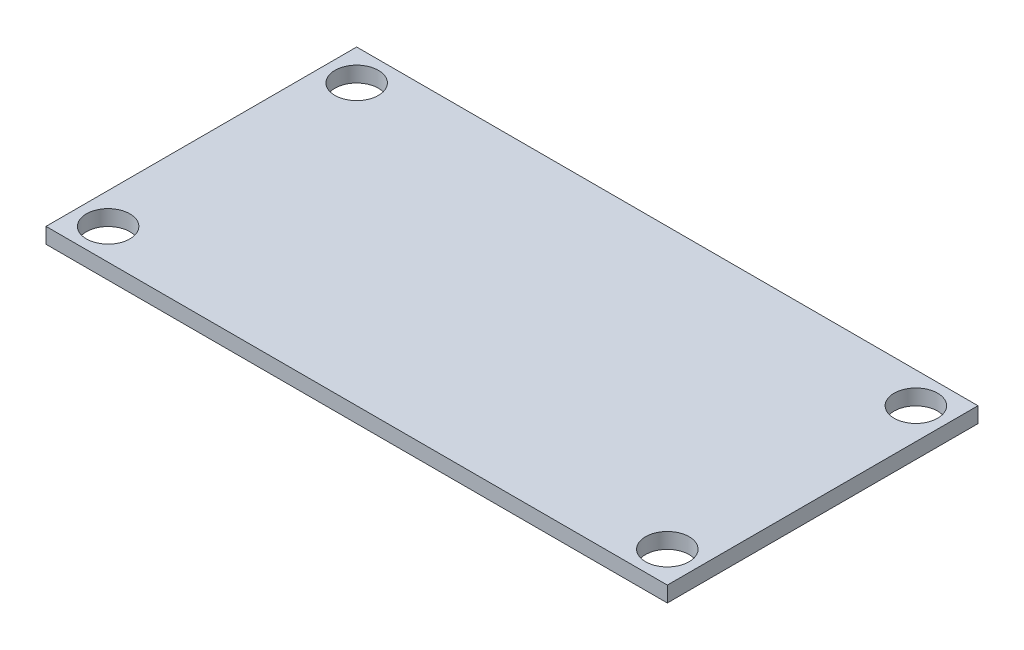
ISO-10303-21;
HEADER;
FILE_DESCRIPTION(('STEP AP214'),'2;1');
FILE_NAME('part.step','',(''),(''),'','','');
FILE_SCHEMA(('AUTOMOTIVE_DESIGN { 1 0 10303 214 1 1 1 1 }'));
ENDSEC;
DATA;
#1=APPLICATION_CONTEXT('core data for automotive mechanical design processes');
#2=APPLICATION_PROTOCOL_DEFINITION('international standard','automotive_design',2000,#1);
#3=PRODUCT_CONTEXT('',#1,'mechanical');
#4=PRODUCT('Part','Part','',(#3));
#5=PRODUCT_RELATED_PRODUCT_CATEGORY('part','',(#4));
#6=PRODUCT_DEFINITION_FORMATION('','',#4);
#7=PRODUCT_DEFINITION_CONTEXT('part definition',#1,'design');
#8=PRODUCT_DEFINITION('design','',#6,#7);
#9=PRODUCT_DEFINITION_SHAPE('','',#8);
#10=(LENGTH_UNIT() NAMED_UNIT(*) SI_UNIT(.MILLI.,.METRE.));
#11=(NAMED_UNIT(*) PLANE_ANGLE_UNIT() SI_UNIT($,.RADIAN.));
#12=(NAMED_UNIT(*) SI_UNIT($,.STERADIAN.) SOLID_ANGLE_UNIT());
#13=UNCERTAINTY_MEASURE_WITH_UNIT(LENGTH_MEASURE(1.E-05),#10,'distance_accuracy_value','');
#14=(GEOMETRIC_REPRESENTATION_CONTEXT(3) GLOBAL_UNCERTAINTY_ASSIGNED_CONTEXT((#13)) GLOBAL_UNIT_ASSIGNED_CONTEXT((#10,
#11,#12)) REPRESENTATION_CONTEXT('',''));
#15=CARTESIAN_POINT('',(0.,0.,0.));
#16=DIRECTION('',(0.,0.,1.));
#17=DIRECTION('',(1.,0.,0.));
#18=AXIS2_PLACEMENT_3D('',#15,#16,#17);
#19=CARTESIAN_POINT('',(0.,1.,0.));
#20=DIRECTION('',(1.,0.,0.));
#21=DIRECTION('',(0.,0.,-1.));
#22=AXIS2_PLACEMENT_3D('',#19,#20,#21);
#23=PLANE('',#22);
#24=DIRECTION('',(0.,0.,1.));
#25=VECTOR('',#24,1.);
#26=CARTESIAN_POINT('',(0.,0.,0.));
#27=LINE('',#26,#25);
#28=CARTESIAN_POINT('',(0.,0.,-20.));
#29=VERTEX_POINT('',#28);
#30=CARTESIAN_POINT('',(0.,0.,0.));
#31=VERTEX_POINT('',#30);
#32=EDGE_CURVE('E96',#29,#31,#27,.T.);
#33=ORIENTED_EDGE('',*,*,#32,.T.);
#34=DIRECTION('',(0.,-1.,0.));
#35=VECTOR('',#34,1.);
#36=CARTESIAN_POINT('',(0.,1.,0.));
#37=LINE('',#36,#35);
#38=CARTESIAN_POINT('',(0.,1.,0.));
#39=VERTEX_POINT('',#38);
#40=EDGE_CURVE('E11',#39,#31,#37,.T.);
#41=ORIENTED_EDGE('',*,*,#40,.F.);
#42=DIRECTION('',(0.,0.,1.));
#43=VECTOR('',#42,1.);
#44=CARTESIAN_POINT('',(0.,1.,0.));
#45=LINE('',#44,#43);
#46=CARTESIAN_POINT('',(0.,1.,-20.));
#47=VERTEX_POINT('',#46);
#48=EDGE_CURVE('E84',#47,#39,#45,.T.);
#49=ORIENTED_EDGE('',*,*,#48,.F.);
#50=DIRECTION('',(0.,-1.,0.));
#51=VECTOR('',#50,1.);
#52=CARTESIAN_POINT('',(0.,1.,-20.));
#53=LINE('',#52,#51);
#54=EDGE_CURVE('E92',#47,#29,#53,.T.);
#55=ORIENTED_EDGE('',*,*,#54,.T.);
#56=EDGE_LOOP('',(#33,#41,#49,#55));
#57=FACE_BOUND('',#56,.T.);
#58=ADVANCED_FACE('F33',(#57),#23,.F.);
#59=CARTESIAN_POINT('',(0.,1.,0.));
#60=DIRECTION('',(0.,0.,-1.));
#61=DIRECTION('',(-1.,0.,0.));
#62=AXIS2_PLACEMENT_3D('',#59,#60,#61);
#63=PLANE('',#62);
#64=DIRECTION('',(1.,0.,0.));
#65=VECTOR('',#64,1.);
#66=CARTESIAN_POINT('',(0.,0.,0.));
#67=LINE('',#66,#65);
#68=CARTESIAN_POINT('',(40.,0.,0.));
#69=VERTEX_POINT('',#68);
#70=EDGE_CURVE('E88',#31,#69,#67,.T.);
#71=ORIENTED_EDGE('',*,*,#70,.T.);
#72=DIRECTION('',(0.,-1.,0.));
#73=VECTOR('',#72,1.);
#74=CARTESIAN_POINT('',(40.,1.,0.));
#75=LINE('',#74,#73);
#76=CARTESIAN_POINT('',(40.,1.,0.));
#77=VERTEX_POINT('',#76);
#78=EDGE_CURVE('E41',#77,#69,#75,.T.);
#79=ORIENTED_EDGE('',*,*,#78,.F.);
#80=DIRECTION('',(1.,0.,0.));
#81=VECTOR('',#80,1.);
#82=CARTESIAN_POINT('',(0.,1.,0.));
#83=LINE('',#82,#81);
#84=EDGE_CURVE('E79',#39,#77,#83,.T.);
#85=ORIENTED_EDGE('',*,*,#84,.F.);
#86=ORIENTED_EDGE('',*,*,#40,.T.);
#87=EDGE_LOOP('',(#71,#79,#85,#86));
#88=FACE_BOUND('',#87,.T.);
#89=ADVANCED_FACE('F87',(#88),#63,.F.);
#90=CARTESIAN_POINT('',(40.,1.,0.));
#91=DIRECTION('',(-1.,0.,0.));
#92=DIRECTION('',(0.,0.,1.));
#93=AXIS2_PLACEMENT_3D('',#90,#91,#92);
#94=PLANE('',#93);
#95=DIRECTION('',(0.,0.,-1.));
#96=VECTOR('',#95,1.);
#97=CARTESIAN_POINT('',(40.,0.,0.));
#98=LINE('',#97,#96);
#99=CARTESIAN_POINT('',(40.,0.,-20.));
#100=VERTEX_POINT('',#99);
#101=EDGE_CURVE('E66',#69,#100,#98,.T.);
#102=ORIENTED_EDGE('',*,*,#101,.T.);
#103=DIRECTION('',(0.,-1.,0.));
#104=VECTOR('',#103,1.);
#105=CARTESIAN_POINT('',(40.,1.,-20.));
#106=LINE('',#105,#104);
#107=CARTESIAN_POINT('',(40.,1.,-20.));
#108=VERTEX_POINT('',#107);
#109=EDGE_CURVE('E89',#108,#100,#106,.T.);
#110=ORIENTED_EDGE('',*,*,#109,.F.);
#111=DIRECTION('',(0.,0.,-1.));
#112=VECTOR('',#111,1.);
#113=CARTESIAN_POINT('',(40.,1.,0.));
#114=LINE('',#113,#112);
#115=EDGE_CURVE('E82',#77,#108,#114,.T.);
#116=ORIENTED_EDGE('',*,*,#115,.F.);
#117=ORIENTED_EDGE('',*,*,#78,.T.);
#118=EDGE_LOOP('',(#102,#110,#116,#117));
#119=FACE_BOUND('',#118,.T.);
#120=ADVANCED_FACE('F90',(#119),#94,.F.);
#121=CARTESIAN_POINT('',(0.,1.,-20.));
#122=DIRECTION('',(0.,0.,1.));
#123=DIRECTION('',(1.,0.,0.));
#124=AXIS2_PLACEMENT_3D('',#121,#122,#123);
#125=PLANE('',#124);
#126=DIRECTION('',(-1.,0.,0.));
#127=VECTOR('',#126,1.);
#128=CARTESIAN_POINT('',(0.,0.,-20.));
#129=LINE('',#128,#127);
#130=EDGE_CURVE('E72',#100,#29,#129,.T.);
#131=ORIENTED_EDGE('',*,*,#130,.T.);
#132=ORIENTED_EDGE('',*,*,#54,.F.);
#133=DIRECTION('',(-1.,0.,0.));
#134=VECTOR('',#133,1.);
#135=CARTESIAN_POINT('',(0.,1.,-20.));
#136=LINE('',#135,#134);
#137=EDGE_CURVE('E49',#108,#47,#136,.T.);
#138=ORIENTED_EDGE('',*,*,#137,.F.);
#139=ORIENTED_EDGE('',*,*,#109,.T.);
#140=EDGE_LOOP('',(#131,#132,#138,#139));
#141=FACE_BOUND('',#140,.T.);
#142=ADVANCED_FACE('F104',(#141),#125,.F.);
#143=CARTESIAN_POINT('',(0.,1.,0.));
#144=DIRECTION('',(0.,-1.,0.));
#145=DIRECTION('',(0.,0.,-1.));
#146=AXIS2_PLACEMENT_3D('',#143,#144,#145);
#147=PLANE('',#146);
#148=CARTESIAN_POINT('',(2.00000000000001,1.,-2.00000000000001));
#149=DIRECTION('',(0.,1.,0.));
#150=DIRECTION('',(0.,0.,1.));
#151=AXIS2_PLACEMENT_3D('',#148,#149,#150);
#152=CIRCLE('',#151,1.4);
#153=CARTESIAN_POINT('',(2.00000000000001,1.,-0.600000000000009));
#154=VERTEX_POINT('',#153);
#155=EDGE_CURVE('E116',#154,#154,#152,.T.);
#156=ORIENTED_EDGE('',*,*,#155,.F.);
#157=EDGE_LOOP('',(#156));
#158=FACE_BOUND('',#157,.T.);
#159=CARTESIAN_POINT('',(38.,1.,-2.));
#160=DIRECTION('',(0.,1.,0.));
#161=DIRECTION('',(0.,0.,1.));
#162=AXIS2_PLACEMENT_3D('',#159,#160,#161);
#163=CIRCLE('',#162,1.4);
#164=CARTESIAN_POINT('',(38.,1.,-0.599999999999999));
#165=VERTEX_POINT('',#164);
#166=EDGE_CURVE('E122',#165,#165,#163,.T.);
#167=ORIENTED_EDGE('',*,*,#166,.F.);
#168=EDGE_LOOP('',(#167));
#169=FACE_BOUND('',#168,.T.);
#170=CARTESIAN_POINT('',(38.,1.,-18.));
#171=DIRECTION('',(0.,1.,0.));
#172=DIRECTION('',(0.,0.,1.));
#173=AXIS2_PLACEMENT_3D('',#170,#171,#172);
#174=CIRCLE('',#173,1.4);
#175=CARTESIAN_POINT('',(38.,1.,-16.6));
#176=VERTEX_POINT('',#175);
#177=EDGE_CURVE('E128',#176,#176,#174,.T.);
#178=ORIENTED_EDGE('',*,*,#177,.F.);
#179=EDGE_LOOP('',(#178));
#180=FACE_BOUND('',#179,.T.);
#181=CARTESIAN_POINT('',(2.,1.,-18.));
#182=DIRECTION('',(0.,1.,0.));
#183=DIRECTION('',(0.,0.,1.));
#184=AXIS2_PLACEMENT_3D('',#181,#182,#183);
#185=CIRCLE('',#184,1.4);
#186=CARTESIAN_POINT('',(2.,1.,-16.6));
#187=VERTEX_POINT('',#186);
#188=EDGE_CURVE('E110',#187,#187,#185,.T.);
#189=ORIENTED_EDGE('',*,*,#188,.F.);
#190=EDGE_LOOP('',(#189));
#191=FACE_BOUND('',#190,.T.);
#192=ORIENTED_EDGE('',*,*,#48,.T.);
#193=ORIENTED_EDGE('',*,*,#84,.T.);
#194=ORIENTED_EDGE('',*,*,#115,.T.);
#195=ORIENTED_EDGE('',*,*,#137,.T.);
#196=EDGE_LOOP('',(#192,#193,#194,#195));
#197=FACE_BOUND('',#196,.T.);
#198=ADVANCED_FACE('F80',(#158,#169,#180,#191,#197),#147,.F.);
#199=CARTESIAN_POINT('',(0.,0.,0.));
#200=DIRECTION('',(0.,-1.,0.));
#201=DIRECTION('',(0.,0.,-1.));
#202=AXIS2_PLACEMENT_3D('',#199,#200,#201);
#203=PLANE('',#202);
#204=CARTESIAN_POINT('',(2.00000000000001,0.,-2.00000000000001));
#205=DIRECTION('',(0.,1.,0.));
#206=DIRECTION('',(0.,0.,1.));
#207=AXIS2_PLACEMENT_3D('',#204,#205,#206);
#208=CIRCLE('',#207,1.4);
#209=CARTESIAN_POINT('',(2.00000000000001,0.,-0.600000000000009));
#210=VERTEX_POINT('',#209);
#211=EDGE_CURVE('E119',#210,#210,#208,.T.);
#212=ORIENTED_EDGE('',*,*,#211,.T.);
#213=EDGE_LOOP('',(#212));
#214=FACE_BOUND('',#213,.T.);
#215=CARTESIAN_POINT('',(38.,0.,-2.));
#216=DIRECTION('',(0.,1.,0.));
#217=DIRECTION('',(0.,0.,1.));
#218=AXIS2_PLACEMENT_3D('',#215,#216,#217);
#219=CIRCLE('',#218,1.4);
#220=CARTESIAN_POINT('',(38.,0.,-0.599999999999999));
#221=VERTEX_POINT('',#220);
#222=EDGE_CURVE('E125',#221,#221,#219,.T.);
#223=ORIENTED_EDGE('',*,*,#222,.T.);
#224=EDGE_LOOP('',(#223));
#225=FACE_BOUND('',#224,.T.);
#226=CARTESIAN_POINT('',(38.,0.,-18.));
#227=DIRECTION('',(0.,1.,0.));
#228=DIRECTION('',(0.,0.,1.));
#229=AXIS2_PLACEMENT_3D('',#226,#227,#228);
#230=CIRCLE('',#229,1.4);
#231=CARTESIAN_POINT('',(38.,0.,-16.6));
#232=VERTEX_POINT('',#231);
#233=EDGE_CURVE('E113',#232,#232,#230,.T.);
#234=ORIENTED_EDGE('',*,*,#233,.T.);
#235=EDGE_LOOP('',(#234));
#236=FACE_BOUND('',#235,.T.);
#237=CARTESIAN_POINT('',(2.,0.,-18.));
#238=DIRECTION('',(0.,1.,0.));
#239=DIRECTION('',(0.,0.,1.));
#240=AXIS2_PLACEMENT_3D('',#237,#238,#239);
#241=CIRCLE('',#240,1.4);
#242=CARTESIAN_POINT('',(2.,0.,-16.6));
#243=VERTEX_POINT('',#242);
#244=EDGE_CURVE('E99',#243,#243,#241,.T.);
#245=ORIENTED_EDGE('',*,*,#244,.T.);
#246=EDGE_LOOP('',(#245));
#247=FACE_BOUND('',#246,.T.);
#248=ORIENTED_EDGE('',*,*,#32,.F.);
#249=ORIENTED_EDGE('',*,*,#130,.F.);
#250=ORIENTED_EDGE('',*,*,#101,.F.);
#251=ORIENTED_EDGE('',*,*,#70,.F.);
#252=EDGE_LOOP('',(#248,#249,#250,#251));
#253=FACE_BOUND('',#252,.T.);
#254=ADVANCED_FACE('F107',(#214,#225,#236,#247,#253),#203,.T.);
#255=CARTESIAN_POINT('',(2.,0.,-18.));
#256=DIRECTION('',(0.,1.,0.));
#257=DIRECTION('',(0.,0.,1.));
#258=AXIS2_PLACEMENT_3D('',#255,#256,#257);
#259=CYLINDRICAL_SURFACE('',#258,1.4);
#260=ORIENTED_EDGE('',*,*,#244,.F.);
#261=EDGE_LOOP('',(#260));
#262=FACE_BOUND('',#261,.T.);
#263=ORIENTED_EDGE('',*,*,#188,.T.);
#264=EDGE_LOOP('',(#263));
#265=FACE_BOUND('',#264,.T.);
#266=ADVANCED_FACE('F140',(#262,#265),#259,.F.);
#267=CARTESIAN_POINT('',(38.,0.,-18.));
#268=DIRECTION('',(0.,1.,0.));
#269=DIRECTION('',(0.,0.,1.));
#270=AXIS2_PLACEMENT_3D('',#267,#268,#269);
#271=CYLINDRICAL_SURFACE('',#270,1.4);
#272=ORIENTED_EDGE('',*,*,#233,.F.);
#273=EDGE_LOOP('',(#272));
#274=FACE_BOUND('',#273,.T.);
#275=ORIENTED_EDGE('',*,*,#177,.T.);
#276=EDGE_LOOP('',(#275));
#277=FACE_BOUND('',#276,.T.);
#278=ADVANCED_FACE('F136',(#274,#277),#271,.F.);
#279=CARTESIAN_POINT('',(38.,0.,-2.));
#280=DIRECTION('',(0.,1.,0.));
#281=DIRECTION('',(0.,0.,1.));
#282=AXIS2_PLACEMENT_3D('',#279,#280,#281);
#283=CYLINDRICAL_SURFACE('',#282,1.4);
#284=ORIENTED_EDGE('',*,*,#222,.F.);
#285=EDGE_LOOP('',(#284));
#286=FACE_BOUND('',#285,.T.);
#287=ORIENTED_EDGE('',*,*,#166,.T.);
#288=EDGE_LOOP('',(#287));
#289=FACE_BOUND('',#288,.T.);
#290=ADVANCED_FACE('F139',(#286,#289),#283,.F.);
#291=CARTESIAN_POINT('',(2.00000000000001,0.,-2.00000000000001));
#292=DIRECTION('',(0.,1.,0.));
#293=DIRECTION('',(0.,0.,1.));
#294=AXIS2_PLACEMENT_3D('',#291,#292,#293);
#295=CYLINDRICAL_SURFACE('',#294,1.4);
#296=ORIENTED_EDGE('',*,*,#211,.F.);
#297=EDGE_LOOP('',(#296));
#298=FACE_BOUND('',#297,.T.);
#299=ORIENTED_EDGE('',*,*,#155,.T.);
#300=EDGE_LOOP('',(#299));
#301=FACE_BOUND('',#300,.T.);
#302=ADVANCED_FACE('F201',(#298,#301),#295,.F.);
#303=CLOSED_SHELL('',(#58,#89,#120,#142,#198,#254,#266,#278,#290,#302));
#304=MANIFOLD_SOLID_BREP('B2',#303);
#305=ADVANCED_BREP_SHAPE_REPRESENTATION('',(#18,#304),#14);
#306=SHAPE_DEFINITION_REPRESENTATION(#9,#305);
ENDSEC;
END-ISO-10303-21;
